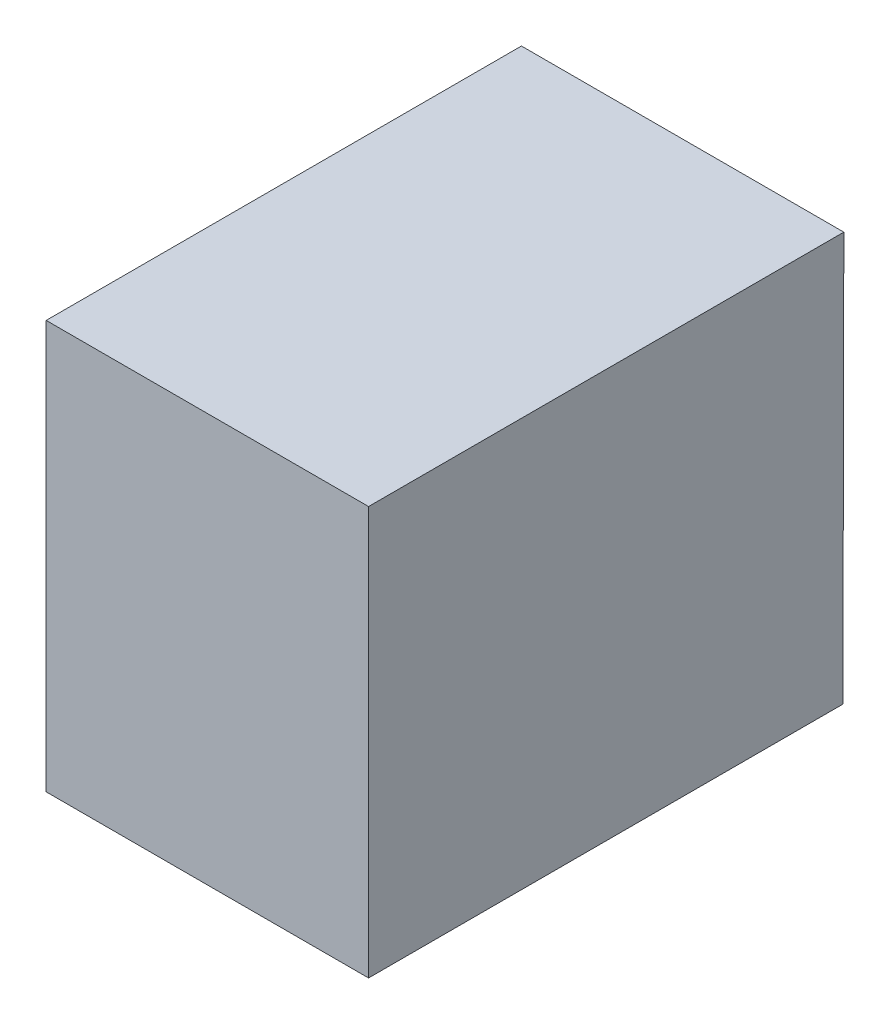
ISO-10303-21;
HEADER;
FILE_DESCRIPTION(('STEP AP214'),'2;1');
FILE_NAME('part.step','',(''),(''),'','','');
FILE_SCHEMA(('AUTOMOTIVE_DESIGN { 1 0 10303 214 1 1 1 1 }'));
ENDSEC;
DATA;
#1=APPLICATION_CONTEXT('core data for automotive mechanical design processes');
#2=APPLICATION_PROTOCOL_DEFINITION('international standard','automotive_design',2000,#1);
#3=PRODUCT_CONTEXT('',#1,'mechanical');
#4=PRODUCT('Part','Part','',(#3));
#5=PRODUCT_RELATED_PRODUCT_CATEGORY('part','',(#4));
#6=PRODUCT_DEFINITION_FORMATION('','',#4);
#7=PRODUCT_DEFINITION_CONTEXT('part definition',#1,'design');
#8=PRODUCT_DEFINITION('design','',#6,#7);
#9=PRODUCT_DEFINITION_SHAPE('','',#8);
#10=(LENGTH_UNIT() NAMED_UNIT(*) SI_UNIT(.MILLI.,.METRE.));
#11=(NAMED_UNIT(*) PLANE_ANGLE_UNIT() SI_UNIT($,.RADIAN.));
#12=(NAMED_UNIT(*) SI_UNIT($,.STERADIAN.) SOLID_ANGLE_UNIT());
#13=UNCERTAINTY_MEASURE_WITH_UNIT(LENGTH_MEASURE(1.E-05),#10,'distance_accuracy_value','');
#14=(GEOMETRIC_REPRESENTATION_CONTEXT(3) GLOBAL_UNCERTAINTY_ASSIGNED_CONTEXT((#13)) GLOBAL_UNIT_ASSIGNED_CONTEXT((#10,
#11,#12)) REPRESENTATION_CONTEXT('',''));
#15=CARTESIAN_POINT('',(0.,0.,0.));
#16=DIRECTION('',(0.,0.,1.));
#17=DIRECTION('',(1.,0.,0.));
#18=AXIS2_PLACEMENT_3D('',#15,#16,#17);
#19=CARTESIAN_POINT('',(-100.2,-54.,-68.8));
#20=DIRECTION('',(-1.,0.,0.));
#21=DIRECTION('',(0.,0.,1.));
#22=AXIS2_PLACEMENT_3D('',#19,#20,#21);
#23=PLANE('',#22);
#24=DIRECTION('',(0.,0.,1.));
#25=VECTOR('',#24,1.);
#26=CARTESIAN_POINT('',(-100.2,26.442515025583,-9.836521770212));
#27=LINE('',#26,#25);
#28=CARTESIAN_POINT('',(-100.2,26.442515025583,-12.7480051335048));
#29=VERTEX_POINT('',#28);
#30=CARTESIAN_POINT('',(-100.19999999985,26.442515025583,-6.92509764654673));
#31=VERTEX_POINT('',#30);
#32=EDGE_CURVE('E61',#29,#31,#27,.T.);
#33=ORIENTED_EDGE('',*,*,#32,.F.);
#34=DIRECTION('',(0.,0.999997466178993,-0.00225114095397013));
#35=VECTOR('',#34,1.);
#36=CARTESIAN_POINT('',(-100.2,21.4400241199526,-12.7367437928211));
#37=LINE('',#36,#35);
#38=CARTESIAN_POINT('',(-100.2,21.4399823097678,-12.7367436987002));
#39=VERTEX_POINT('',#38);
#40=EDGE_CURVE('E20',#29,#39,#37,.F.);
#41=ORIENTED_EDGE('',*,*,#40,.T.);
#42=DIRECTION('',(0.,0.,1.));
#43=VECTOR('',#42,1.);
#44=CARTESIAN_POINT('',(-100.2,21.43998231023,-68.8));
#45=LINE('',#44,#43);
#46=CARTESIAN_POINT('',(-100.199999999775,21.43998231005,-6.92509764654673));
#47=VERTEX_POINT('',#46);
#48=EDGE_CURVE('E63',#39,#47,#45,.T.);
#49=ORIENTED_EDGE('',*,*,#48,.T.);
#50=DIRECTION('',(0.,1.,0.));
#51=VECTOR('',#50,1.);
#52=CARTESIAN_POINT('',(-100.199999999699,23.94126832853,-6.92509764654673));
#53=LINE('',#52,#51);
#54=EDGE_CURVE('E60',#31,#47,#53,.F.);
#55=ORIENTED_EDGE('',*,*,#54,.F.);
#56=EDGE_LOOP('',(#33,#41,#49,#55));
#57=FACE_BOUND('',#56,.T.);
#58=ADVANCED_FACE('F17',(#57),#23,.T.);
#59=CARTESIAN_POINT('',(-98.22492057212,23.94128185058,-12.74237449078));
#60=DIRECTION('',(-1.12012191647992E-11,0.00225114095396998,0.999997466178993));
#61=DIRECTION('',(0.,-0.999997466178993,0.00225114095396998));
#62=AXIS2_PLACEMENT_3D('',#59,#60,#61);
#63=PLANE('',#62);
#64=DIRECTION('',(0.,-0.999997466178993,0.00225114095396998));
#65=VECTOR('',#64,1.);
#66=CARTESIAN_POINT('',(-96.25,23.9412818505801,-12.7423744907579));
#67=LINE('',#66,#65);
#68=CARTESIAN_POINT('',(-96.2500000002985,26.4425677283566,-12.7480056764761));
#69=VERTEX_POINT('',#68);
#70=CARTESIAN_POINT('',(-96.25,21.43998231023,-12.736743698657));
#71=VERTEX_POINT('',#70);
#72=EDGE_CURVE('E70',#69,#71,#67,.T.);
#73=ORIENTED_EDGE('',*,*,#72,.T.);
#74=DIRECTION('',(1.,0.,1.12011907829148E-11));
#75=VECTOR('',#74,1.);
#76=CARTESIAN_POINT('',(-98.22492057212,21.4399823093056,-12.7367436986771));
#77=LINE('',#76,#75);
#78=EDGE_CURVE('E78',#71,#39,#77,.F.);
#79=ORIENTED_EDGE('',*,*,#78,.T.);
#80=ORIENTED_EDGE('',*,*,#40,.F.);
#81=DIRECTION('',(-0.999999999910989,-1.33424743350699E-05,0.));
#82=VECTOR('',#81,1.);
#83=CARTESIAN_POINT('',(-98.22496925747,26.44254137738,-12.74800610085));
#84=LINE('',#83,#82);
#85=EDGE_CURVE('E69',#69,#29,#84,.T.);
#86=ORIENTED_EDGE('',*,*,#85,.F.);
#87=EDGE_LOOP('',(#73,#79,#80,#86));
#88=FACE_BOUND('',#87,.T.);
#89=ADVANCED_FACE('F80',(#88),#63,.F.);
#90=CARTESIAN_POINT('',(-98.225,21.43998231023,-9.830920278475));
#91=DIRECTION('',(0.,1.,0.));
#92=DIRECTION('',(0.,0.,1.));
#93=AXIS2_PLACEMENT_3D('',#90,#91,#92);
#94=PLANE('',#93);
#95=DIRECTION('',(0.,0.,1.));
#96=VECTOR('',#95,1.);
#97=CARTESIAN_POINT('',(-96.25,21.43998231023,-9.830920278475));
#98=LINE('',#97,#96);
#99=CARTESIAN_POINT('',(-96.25,21.43998231014,-6.92509964941775));
#100=VERTEX_POINT('',#99);
#101=EDGE_CURVE('E85',#71,#100,#98,.T.);
#102=ORIENTED_EDGE('',*,*,#101,.T.);
#103=DIRECTION('',(0.999999999999864,0.,-5.21543234827581E-07));
#104=VECTOR('',#103,1.);
#105=CARTESIAN_POINT('',(-98.22499351075,21.43998230987,-6.925098676598));
#106=LINE('',#105,#104);
#107=EDGE_CURVE('E66',#47,#100,#106,.T.);
#108=ORIENTED_EDGE('',*,*,#107,.F.);
#109=ORIENTED_EDGE('',*,*,#48,.F.);
#110=ORIENTED_EDGE('',*,*,#78,.F.);
#111=EDGE_LOOP('',(#102,#108,#109,#110));
#112=FACE_BOUND('',#111,.T.);
#113=ADVANCED_FACE('F84',(#112),#94,.F.);
#114=CARTESIAN_POINT('',(-98.22499351075,23.94126832853,-6.925098676598));
#115=DIRECTION('',(5.21543234827581E-07,0.,0.999999999999864));
#116=DIRECTION('',(0.999999999999864,0.,-5.21543234827581E-07));
#117=AXIS2_PLACEMENT_3D('',#114,#115,#116);
#118=PLANE('',#117);
#119=DIRECTION('',(0.999999999910853,1.3342474335068E-05,-5.21543234781158E-07));
#120=VECTOR('',#119,1.);
#121=CARTESIAN_POINT('',(-98.224967739037,26.4425413774003,-6.92509867661144));
#122=LINE('',#121,#120);
#123=CARTESIAN_POINT('',(-96.2500000004477,26.4425677283566,-6.92509964941775));
#124=VERTEX_POINT('',#123);
#125=EDGE_CURVE('E34',#31,#124,#122,.T.);
#126=ORIENTED_EDGE('',*,*,#125,.F.);
#127=ORIENTED_EDGE('',*,*,#54,.T.);
#128=ORIENTED_EDGE('',*,*,#107,.T.);
#129=DIRECTION('',(0.,1.,0.));
#130=VECTOR('',#129,1.);
#131=CARTESIAN_POINT('',(-96.25,-54.,-6.925099592193));
#132=LINE('',#131,#130);
#133=EDGE_CURVE('E26',#100,#124,#132,.T.);
#134=ORIENTED_EDGE('',*,*,#133,.T.);
#135=EDGE_LOOP('',(#126,#127,#128,#134));
#136=FACE_BOUND('',#135,.T.);
#137=ADVANCED_FACE('F73',(#136),#118,.T.);
#138=CARTESIAN_POINT('',(-98.22496925747,26.44254137738,-9.836521770212));
#139=DIRECTION('',(-1.33424743350699E-05,0.999999999910989,0.));
#140=DIRECTION('',(-0.999999999910989,-1.33424743350699E-05,0.));
#141=AXIS2_PLACEMENT_3D('',#138,#139,#140);
#142=PLANE('',#141);
#143=ORIENTED_EDGE('',*,*,#85,.T.);
#144=ORIENTED_EDGE('',*,*,#32,.T.);
#145=ORIENTED_EDGE('',*,*,#125,.T.);
#146=DIRECTION('',(0.,0.,1.));
#147=VECTOR('',#146,1.);
#148=CARTESIAN_POINT('',(-96.2500000005969,26.4425677283566,-9.836521770212));
#149=LINE('',#148,#147);
#150=EDGE_CURVE('E11',#124,#69,#149,.F.);
#151=ORIENTED_EDGE('',*,*,#150,.T.);
#152=EDGE_LOOP('',(#143,#144,#145,#151));
#153=FACE_BOUND('',#152,.T.);
#154=ADVANCED_FACE('F68',(#153),#142,.T.);
#155=CARTESIAN_POINT('',(-96.25,-54.,-68.8));
#156=DIRECTION('',(-1.,0.,0.));
#157=DIRECTION('',(0.,0.,1.));
#158=AXIS2_PLACEMENT_3D('',#155,#156,#157);
#159=PLANE('',#158);
#160=ORIENTED_EDGE('',*,*,#133,.F.);
#161=ORIENTED_EDGE('',*,*,#101,.F.);
#162=ORIENTED_EDGE('',*,*,#72,.F.);
#163=ORIENTED_EDGE('',*,*,#150,.F.);
#164=EDGE_LOOP('',(#160,#161,#162,#163));
#165=FACE_BOUND('',#164,.T.);
#166=ADVANCED_FACE('F87',(#165),#159,.F.);
#167=CLOSED_SHELL('',(#58,#89,#113,#137,#154,#166));
#168=MANIFOLD_SOLID_BREP('B1',#167);
#169=ADVANCED_BREP_SHAPE_REPRESENTATION('',(#18,#168),#14);
#170=SHAPE_DEFINITION_REPRESENTATION(#9,#169);
ENDSEC;
END-ISO-10303-21;
